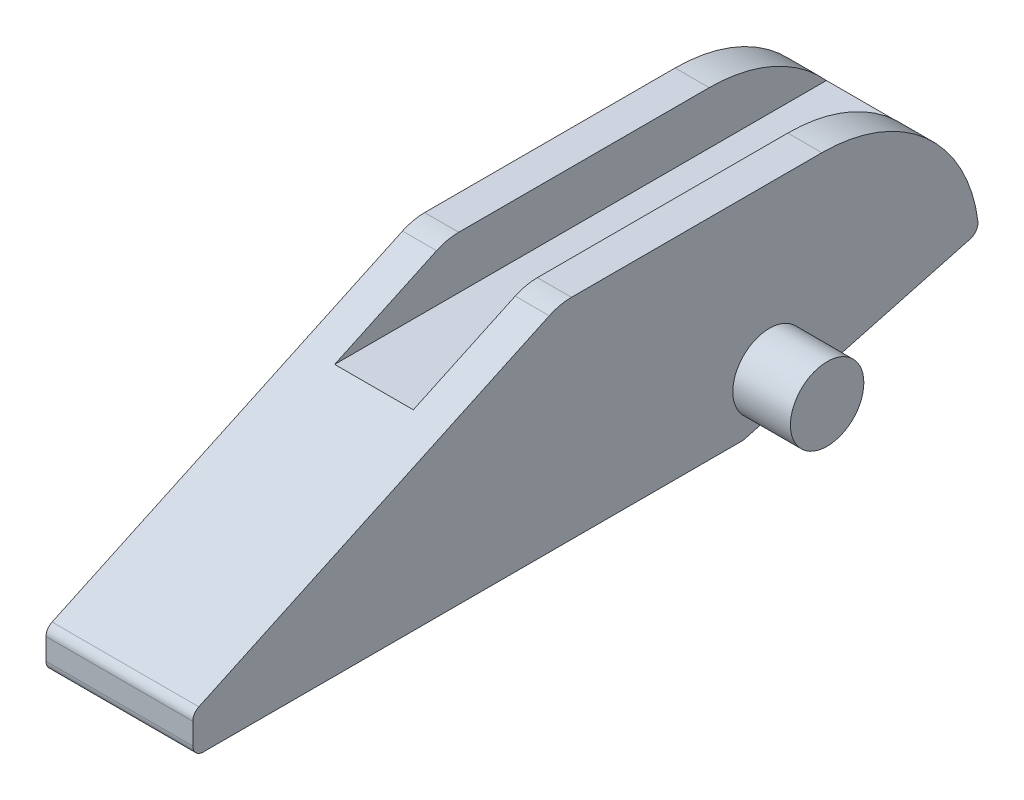
ISO-10303-21;
HEADER;
FILE_DESCRIPTION(('STEP AP214'),'2;1');
FILE_NAME('part.step','',(''),(''),'','','');
FILE_SCHEMA(('AUTOMOTIVE_DESIGN { 1 0 10303 214 1 1 1 1 }'));
ENDSEC;
DATA;
#1=APPLICATION_CONTEXT('core data for automotive mechanical design processes');
#2=APPLICATION_PROTOCOL_DEFINITION('international standard','automotive_design',2000,#1);
#3=PRODUCT_CONTEXT('',#1,'mechanical');
#4=PRODUCT('Part','Part','',(#3));
#5=PRODUCT_RELATED_PRODUCT_CATEGORY('part','',(#4));
#6=PRODUCT_DEFINITION_FORMATION('','',#4);
#7=PRODUCT_DEFINITION_CONTEXT('part definition',#1,'design');
#8=PRODUCT_DEFINITION('design','',#6,#7);
#9=PRODUCT_DEFINITION_SHAPE('','',#8);
#10=(LENGTH_UNIT() NAMED_UNIT(*) SI_UNIT(.MILLI.,.METRE.));
#11=(NAMED_UNIT(*) PLANE_ANGLE_UNIT() SI_UNIT($,.RADIAN.));
#12=(NAMED_UNIT(*) SI_UNIT($,.STERADIAN.) SOLID_ANGLE_UNIT());
#13=UNCERTAINTY_MEASURE_WITH_UNIT(LENGTH_MEASURE(1.E-05),#10,'distance_accuracy_value','');
#14=(GEOMETRIC_REPRESENTATION_CONTEXT(3) GLOBAL_UNCERTAINTY_ASSIGNED_CONTEXT((#13)) GLOBAL_UNIT_ASSIGNED_CONTEXT((#10,
#11,#12)) REPRESENTATION_CONTEXT('',''));
#15=CARTESIAN_POINT('',(0.,0.,0.));
#16=DIRECTION('',(0.,0.,1.));
#17=DIRECTION('',(1.,0.,0.));
#18=AXIS2_PLACEMENT_3D('',#15,#16,#17);
#19=CARTESIAN_POINT('',(1.4,0.999999999999998,3.));
#20=DIRECTION('',(-1.,0.,0.));
#21=DIRECTION('',(0.,0.,1.));
#22=AXIS2_PLACEMENT_3D('',#19,#20,#21);
#23=CYLINDRICAL_SURFACE('',#22,3.);
#24=CARTESIAN_POINT('',(1.4,0.999999999999998,3.));
#25=DIRECTION('',(1.,0.,0.));
#26=DIRECTION('',(0.,0.,1.));
#27=AXIS2_PLACEMENT_3D('',#24,#25,#26);
#28=CIRCLE('',#27,3.);
#29=CARTESIAN_POINT('',(1.4,1.37847392209244,0.0239695078349815));
#30=VERTEX_POINT('',#29);
#31=CARTESIAN_POINT('',(1.4,4.,3.));
#32=VERTEX_POINT('',#31);
#33=EDGE_CURVE('E255',#30,#32,#28,.T.);
#34=ORIENTED_EDGE('',*,*,#33,.F.);
#35=DIRECTION('',(-1.,0.,0.));
#36=VECTOR('',#35,1.);
#37=CARTESIAN_POINT('',(1.4,1.37847392209244,0.0239695078349811));
#38=LINE('',#37,#36);
#39=CARTESIAN_POINT('',(-1.4,1.37847392209244,0.0239695078349815));
#40=VERTEX_POINT('',#39);
#41=EDGE_CURVE('E334',#30,#40,#38,.T.);
#42=ORIENTED_EDGE('',*,*,#41,.T.);
#43=CARTESIAN_POINT('',(-1.4,0.999999999999998,3.));
#44=DIRECTION('',(1.,0.,0.));
#45=DIRECTION('',(0.,0.,1.));
#46=AXIS2_PLACEMENT_3D('',#43,#44,#45);
#47=CIRCLE('',#46,3.);
#48=CARTESIAN_POINT('',(-1.4,4.,3.));
#49=VERTEX_POINT('',#48);
#50=EDGE_CURVE('E273',#40,#49,#47,.T.);
#51=ORIENTED_EDGE('',*,*,#50,.T.);
#52=DIRECTION('',(-1.,0.,0.));
#53=VECTOR('',#52,1.);
#54=CARTESIAN_POINT('',(1.4,4.,3.));
#55=LINE('',#54,#53);
#56=CARTESIAN_POINT('',(-0.75,4.,3.));
#57=VERTEX_POINT('',#56);
#58=EDGE_CURVE('E236',#57,#49,#55,.T.);
#59=ORIENTED_EDGE('',*,*,#58,.F.);
#60=CARTESIAN_POINT('',(-0.75,0.999999999999998,3.));
#61=DIRECTION('',(1.,0.,0.));
#62=DIRECTION('',(0.,0.,-1.));
#63=AXIS2_PLACEMENT_3D('',#60,#61,#62);
#64=CIRCLE('',#63,3.);
#65=CARTESIAN_POINT('',(-0.75,3.,0.763932022500208));
#66=VERTEX_POINT('',#65);
#67=EDGE_CURVE('E226',#66,#57,#64,.T.);
#68=ORIENTED_EDGE('',*,*,#67,.F.);
#69=DIRECTION('',(-1.,0.,0.));
#70=VECTOR('',#69,1.);
#71=CARTESIAN_POINT('',(1.4,3.,0.763932022500209));
#72=LINE('',#71,#70);
#73=CARTESIAN_POINT('',(0.75,3.,0.763932022500208));
#74=VERTEX_POINT('',#73);
#75=EDGE_CURVE('E212',#66,#74,#72,.F.);
#76=ORIENTED_EDGE('',*,*,#75,.T.);
#77=CARTESIAN_POINT('',(0.75,0.999999999999998,3.));
#78=DIRECTION('',(-1.,0.,0.));
#79=DIRECTION('',(0.,0.,1.));
#80=AXIS2_PLACEMENT_3D('',#77,#78,#79);
#81=CIRCLE('',#80,3.);
#82=CARTESIAN_POINT('',(0.75,4.,3.));
#83=VERTEX_POINT('',#82);
#84=EDGE_CURVE('E243',#83,#74,#81,.T.);
#85=ORIENTED_EDGE('',*,*,#84,.F.);
#86=EDGE_CURVE('E254',#32,#83,#55,.T.);
#87=ORIENTED_EDGE('',*,*,#86,.F.);
#88=EDGE_LOOP('',(#34,#42,#51,#59,#68,#76,#85,#87));
#89=FACE_BOUND('',#88,.T.);
#90=ADVANCED_FACE('F38',(#89),#23,.T.);
#91=CARTESIAN_POINT('',(1.4,4.,7.77738173825931));
#92=DIRECTION('',(0.,-1.,0.));
#93=DIRECTION('',(0.,0.,-1.));
#94=AXIS2_PLACEMENT_3D('',#91,#92,#93);
#95=PLANE('',#94);
#96=DIRECTION('',(0.,0.,-1.));
#97=VECTOR('',#96,1.);
#98=CARTESIAN_POINT('',(-0.750000000000002,4.,15.));
#99=LINE('',#98,#97);
#100=CARTESIAN_POINT('',(-0.750000000000001,4.,7.77738173825931));
#101=VERTEX_POINT('',#100);
#102=EDGE_CURVE('E427',#101,#57,#99,.T.);
#103=ORIENTED_EDGE('',*,*,#102,.T.);
#104=ORIENTED_EDGE('',*,*,#58,.T.);
#105=DIRECTION('',(0.,0.,1.));
#106=VECTOR('',#105,1.);
#107=CARTESIAN_POINT('',(-1.4,4.,7.77738173825931));
#108=LINE('',#107,#106);
#109=CARTESIAN_POINT('',(-1.4,4.,7.77738173825931));
#110=VERTEX_POINT('',#109);
#111=EDGE_CURVE('E275',#49,#110,#108,.T.);
#112=ORIENTED_EDGE('',*,*,#111,.T.);
#113=DIRECTION('',(-1.,0.,0.));
#114=VECTOR('',#113,1.);
#115=CARTESIAN_POINT('',(1.4,4.,7.77738173825931));
#116=LINE('',#115,#114);
#117=EDGE_CURVE('E299',#101,#110,#116,.T.);
#118=ORIENTED_EDGE('',*,*,#117,.F.);
#119=EDGE_LOOP('',(#103,#104,#112,#118));
#120=FACE_BOUND('',#119,.T.);
#121=ADVANCED_FACE('F494',(#120),#95,.F.);
#122=DIRECTION('',(0.,0.,1.));
#123=VECTOR('',#122,1.);
#124=CARTESIAN_POINT('',(0.750000000000002,4.,15.));
#125=LINE('',#124,#123);
#126=CARTESIAN_POINT('',(0.750000000000001,4.,7.77738173825931));
#127=VERTEX_POINT('',#126);
#128=EDGE_CURVE('E231',#83,#127,#125,.T.);
#129=ORIENTED_EDGE('',*,*,#128,.T.);
#130=CARTESIAN_POINT('',(1.4,4.,7.77738173825931));
#131=VERTEX_POINT('',#130);
#132=EDGE_CURVE('E300',#131,#127,#116,.T.);
#133=ORIENTED_EDGE('',*,*,#132,.F.);
#134=DIRECTION('',(0.,0.,1.));
#135=VECTOR('',#134,1.);
#136=CARTESIAN_POINT('',(1.4,4.,7.77738173825931));
#137=LINE('',#136,#135);
#138=EDGE_CURVE('E257',#32,#131,#137,.T.);
#139=ORIENTED_EDGE('',*,*,#138,.F.);
#140=ORIENTED_EDGE('',*,*,#86,.T.);
#141=EDGE_LOOP('',(#129,#133,#139,#140));
#142=FACE_BOUND('',#141,.T.);
#143=ADVANCED_FACE('F439',(#142),#95,.F.);
#144=CARTESIAN_POINT('',(1.4,3.,7.77738173825931));
#145=DIRECTION('',(-1.,0.,0.));
#146=DIRECTION('',(0.,0.,1.));
#147=AXIS2_PLACEMENT_3D('',#144,#145,#146);
#148=CYLINDRICAL_SURFACE('',#147,1.);
#149=CARTESIAN_POINT('',(-0.750000000000001,3.,7.77738173825931));
#150=DIRECTION('',(1.,0.,0.));
#151=DIRECTION('',(0.,0.,-1.));
#152=AXIS2_PLACEMENT_3D('',#149,#150,#151);
#153=CIRCLE('',#152,1.);
#154=CARTESIAN_POINT('',(-0.750000000000001,3.90630778703665,8.2));
#155=VERTEX_POINT('',#154);
#156=EDGE_CURVE('E238',#101,#155,#153,.T.);
#157=ORIENTED_EDGE('',*,*,#156,.F.);
#158=ORIENTED_EDGE('',*,*,#117,.T.);
#159=CARTESIAN_POINT('',(-1.4,3.,7.77738173825931));
#160=DIRECTION('',(1.,0.,0.));
#161=DIRECTION('',(0.,0.,1.));
#162=AXIS2_PLACEMENT_3D('',#159,#160,#161);
#163=CIRCLE('',#162,1.);
#164=CARTESIAN_POINT('',(-1.4,3.90630778703665,8.2));
#165=VERTEX_POINT('',#164);
#166=EDGE_CURVE('E278',#110,#165,#163,.T.);
#167=ORIENTED_EDGE('',*,*,#166,.T.);
#168=DIRECTION('',(-1.,0.,0.));
#169=VECTOR('',#168,1.);
#170=CARTESIAN_POINT('',(1.4,3.90630778703665,8.2));
#171=LINE('',#170,#169);
#172=EDGE_CURVE('E295',#155,#165,#171,.T.);
#173=ORIENTED_EDGE('',*,*,#172,.F.);
#174=EDGE_LOOP('',(#157,#158,#167,#173));
#175=FACE_BOUND('',#174,.T.);
#176=ADVANCED_FACE('F491',(#175),#148,.T.);
#177=CARTESIAN_POINT('',(0.750000000000001,3.,7.77738173825931));
#178=DIRECTION('',(-1.,0.,0.));
#179=DIRECTION('',(0.,0.,1.));
#180=AXIS2_PLACEMENT_3D('',#177,#178,#179);
#181=CIRCLE('',#180,1.);
#182=CARTESIAN_POINT('',(0.750000000000001,3.90630778703665,8.2));
#183=VERTEX_POINT('',#182);
#184=EDGE_CURVE('E222',#183,#127,#181,.T.);
#185=ORIENTED_EDGE('',*,*,#184,.F.);
#186=CARTESIAN_POINT('',(1.4,3.90630778703665,8.2));
#187=VERTEX_POINT('',#186);
#188=EDGE_CURVE('E296',#187,#183,#171,.T.);
#189=ORIENTED_EDGE('',*,*,#188,.F.);
#190=CARTESIAN_POINT('',(1.4,3.,7.77738173825931));
#191=DIRECTION('',(1.,0.,0.));
#192=DIRECTION('',(0.,0.,1.));
#193=AXIS2_PLACEMENT_3D('',#190,#191,#192);
#194=CIRCLE('',#193,1.);
#195=EDGE_CURVE('E260',#131,#187,#194,.T.);
#196=ORIENTED_EDGE('',*,*,#195,.F.);
#197=ORIENTED_EDGE('',*,*,#132,.T.);
#198=EDGE_LOOP('',(#185,#189,#196,#197));
#199=FACE_BOUND('',#198,.T.);
#200=ADVANCED_FACE('F638',(#199),#148,.T.);
#201=CARTESIAN_POINT('',(1.4,0.789263216828548,14.8845236523481));
#202=DIRECTION('',(0.,-0.906307787036653,-0.422618261740694));
#203=DIRECTION('',(0.,0.422618261740694,-0.906307787036653));
#204=AXIS2_PLACEMENT_3D('',#201,#202,#203);
#205=PLANE('',#204);
#206=DIRECTION('',(0.,-0.422618261740694,0.906307787036653));
#207=VECTOR('',#206,1.);
#208=CARTESIAN_POINT('',(-0.750000000000002,0.789263216828548,14.8845236523481));
#209=LINE('',#208,#207);
#210=CARTESIAN_POINT('',(-0.750000000000002,3.,10.1435833214118));
#211=VERTEX_POINT('',#210);
#212=EDGE_CURVE('E229',#155,#211,#209,.T.);
#213=ORIENTED_EDGE('',*,*,#212,.F.);
#214=ORIENTED_EDGE('',*,*,#172,.T.);
#215=DIRECTION('',(0.,-0.422618261740694,0.906307787036653));
#216=VECTOR('',#215,1.);
#217=CARTESIAN_POINT('',(-1.4,0.789263216828548,14.8845236523481));
#218=LINE('',#217,#216);
#219=CARTESIAN_POINT('',(-1.4,0.789263216828549,14.8845236523481));
#220=VERTEX_POINT('',#219);
#221=EDGE_CURVE('E281',#165,#220,#218,.T.);
#222=ORIENTED_EDGE('',*,*,#221,.T.);
#223=DIRECTION('',(-1.,0.,0.));
#224=VECTOR('',#223,1.);
#225=CARTESIAN_POINT('',(1.4,0.789263216828549,14.8845236523481));
#226=LINE('',#225,#224);
#227=CARTESIAN_POINT('',(1.4,0.789263216828549,14.8845236523481));
#228=VERTEX_POINT('',#227);
#229=EDGE_CURVE('E292',#228,#220,#226,.T.);
#230=ORIENTED_EDGE('',*,*,#229,.F.);
#231=DIRECTION('',(0.,-0.422618261740694,0.906307787036653));
#232=VECTOR('',#231,1.);
#233=CARTESIAN_POINT('',(1.4,0.789263216828548,14.8845236523481));
#234=LINE('',#233,#232);
#235=EDGE_CURVE('E262',#187,#228,#234,.T.);
#236=ORIENTED_EDGE('',*,*,#235,.F.);
#237=ORIENTED_EDGE('',*,*,#188,.T.);
#238=DIRECTION('',(0.,0.422618261740694,-0.906307787036653));
#239=VECTOR('',#238,1.);
#240=CARTESIAN_POINT('',(0.750000000000002,0.789263216828548,14.8845236523481));
#241=LINE('',#240,#239);
#242=CARTESIAN_POINT('',(0.750000000000001,3.,10.1435833214118));
#243=VERTEX_POINT('',#242);
#244=EDGE_CURVE('E308',#243,#183,#241,.T.);
#245=ORIENTED_EDGE('',*,*,#244,.F.);
#246=DIRECTION('',(-1.,0.,0.));
#247=VECTOR('',#246,1.);
#248=CARTESIAN_POINT('',(1.4,3.,10.1435833214118));
#249=LINE('',#248,#247);
#250=EDGE_CURVE('E253',#243,#211,#249,.T.);
#251=ORIENTED_EDGE('',*,*,#250,.T.);
#252=EDGE_LOOP('',(#213,#214,#222,#230,#236,#237,#245,#251));
#253=FACE_BOUND('',#252,.T.);
#254=ADVANCED_FACE('F486',(#253),#205,.F.);
#255=CARTESIAN_POINT('',(1.4,0.608001659421218,14.8));
#256=DIRECTION('',(-1.,0.,0.));
#257=DIRECTION('',(0.,0.,1.));
#258=AXIS2_PLACEMENT_3D('',#255,#256,#257);
#259=CYLINDRICAL_SURFACE('',#258,0.2);
#260=CARTESIAN_POINT('',(-1.4,0.608001659421218,14.8));
#261=DIRECTION('',(1.,0.,0.));
#262=DIRECTION('',(0.,0.,1.));
#263=AXIS2_PLACEMENT_3D('',#260,#261,#262);
#264=CIRCLE('',#263,0.2);
#265=CARTESIAN_POINT('',(-1.4,0.608001659421218,15.));
#266=VERTEX_POINT('',#265);
#267=EDGE_CURVE('E283',#220,#266,#264,.T.);
#268=ORIENTED_EDGE('',*,*,#267,.T.);
#269=DIRECTION('',(-1.,0.,0.));
#270=VECTOR('',#269,1.);
#271=CARTESIAN_POINT('',(1.4,0.608001659421218,15.));
#272=LINE('',#271,#270);
#273=CARTESIAN_POINT('',(1.4,0.608001659421218,15.));
#274=VERTEX_POINT('',#273);
#275=EDGE_CURVE('E272',#274,#266,#272,.T.);
#276=ORIENTED_EDGE('',*,*,#275,.F.);
#277=CARTESIAN_POINT('',(1.4,0.608001659421218,14.8));
#278=DIRECTION('',(1.,0.,0.));
#279=DIRECTION('',(0.,0.,1.));
#280=AXIS2_PLACEMENT_3D('',#277,#278,#279);
#281=CIRCLE('',#280,0.2);
#282=EDGE_CURVE('E264',#228,#274,#281,.T.);
#283=ORIENTED_EDGE('',*,*,#282,.F.);
#284=ORIENTED_EDGE('',*,*,#229,.T.);
#285=EDGE_LOOP('',(#268,#276,#283,#284));
#286=FACE_BOUND('',#285,.T.);
#287=ADVANCED_FACE('F481',(#286),#259,.T.);
#288=CARTESIAN_POINT('',(1.4,0.608001659421218,15.));
#289=DIRECTION('',(0.,0.,-1.));
#290=DIRECTION('',(-1.,0.,0.));
#291=AXIS2_PLACEMENT_3D('',#288,#289,#290);
#292=PLANE('',#291);
#293=DIRECTION('',(0.,-1.,0.));
#294=VECTOR('',#293,1.);
#295=CARTESIAN_POINT('',(-1.4,0.608001659421218,15.));
#296=LINE('',#295,#294);
#297=CARTESIAN_POINT('',(-1.4,0.199999999999998,15.));
#298=VERTEX_POINT('',#297);
#299=EDGE_CURVE('E285',#266,#298,#296,.T.);
#300=ORIENTED_EDGE('',*,*,#299,.T.);
#301=DIRECTION('',(-1.,0.,0.));
#302=VECTOR('',#301,1.);
#303=CARTESIAN_POINT('',(1.4,0.199999999999998,15.));
#304=LINE('',#303,#302);
#305=CARTESIAN_POINT('',(1.4,0.199999999999998,15.));
#306=VERTEX_POINT('',#305);
#307=EDGE_CURVE('E326',#298,#306,#304,.F.);
#308=ORIENTED_EDGE('',*,*,#307,.T.);
#309=DIRECTION('',(0.,-1.,0.));
#310=VECTOR('',#309,1.);
#311=CARTESIAN_POINT('',(1.4,0.608001659421218,15.));
#312=LINE('',#311,#310);
#313=EDGE_CURVE('E266',#274,#306,#312,.T.);
#314=ORIENTED_EDGE('',*,*,#313,.F.);
#315=ORIENTED_EDGE('',*,*,#275,.T.);
#316=EDGE_LOOP('',(#300,#308,#314,#315));
#317=FACE_BOUND('',#316,.T.);
#318=ADVANCED_FACE('F476',(#317),#292,.F.);
#319=CARTESIAN_POINT('',(1.4,0.,0.));
#320=DIRECTION('',(0.,1.,0.));
#321=DIRECTION('',(0.,0.,1.));
#322=AXIS2_PLACEMENT_3D('',#319,#320,#321);
#323=PLANE('',#322);
#324=DIRECTION('',(1.,0.,0.));
#325=VECTOR('',#324,1.);
#326=CARTESIAN_POINT('',(0.8,0.,5.52633049951747));
#327=LINE('',#326,#325);
#328=CARTESIAN_POINT('',(-0.6,0.,5.52633049951747));
#329=VERTEX_POINT('',#328);
#330=CARTESIAN_POINT('',(0.6,0.,5.52633049951747));
#331=VERTEX_POINT('',#330);
#332=EDGE_CURVE('E413',#329,#331,#327,.T.);
#333=ORIENTED_EDGE('',*,*,#332,.F.);
#334=CARTESIAN_POINT('',(-0.6,0.,5.72633049951747));
#335=DIRECTION('',(0.,1.,0.));
#336=DIRECTION('',(0.,0.,1.));
#337=AXIS2_PLACEMENT_3D('',#334,#335,#336);
#338=CIRCLE('',#337,0.2);
#339=CARTESIAN_POINT('',(-0.8,0.,5.72633049951747));
#340=VERTEX_POINT('',#339);
#341=EDGE_CURVE('E375',#329,#340,#338,.T.);
#342=ORIENTED_EDGE('',*,*,#341,.T.);
#343=DIRECTION('',(0.,0.,-1.));
#344=VECTOR('',#343,1.);
#345=CARTESIAN_POINT('',(-0.8,0.,13.8));
#346=LINE('',#345,#344);
#347=CARTESIAN_POINT('',(-0.8,0.,13.6));
#348=VERTEX_POINT('',#347);
#349=EDGE_CURVE('E411',#348,#340,#346,.T.);
#350=ORIENTED_EDGE('',*,*,#349,.F.);
#351=CARTESIAN_POINT('',(-0.6,0.,13.6));
#352=DIRECTION('',(0.,1.,0.));
#353=DIRECTION('',(0.,0.,1.));
#354=AXIS2_PLACEMENT_3D('',#351,#352,#353);
#355=CIRCLE('',#354,0.2);
#356=CARTESIAN_POINT('',(-0.6,0.,13.8));
#357=VERTEX_POINT('',#356);
#358=EDGE_CURVE('E373',#348,#357,#355,.T.);
#359=ORIENTED_EDGE('',*,*,#358,.T.);
#360=DIRECTION('',(-1.,0.,0.));
#361=VECTOR('',#360,1.);
#362=CARTESIAN_POINT('',(0.8,0.,13.8));
#363=LINE('',#362,#361);
#364=CARTESIAN_POINT('',(0.6,0.,13.8));
#365=VERTEX_POINT('',#364);
#366=EDGE_CURVE('E422',#365,#357,#363,.T.);
#367=ORIENTED_EDGE('',*,*,#366,.F.);
#368=CARTESIAN_POINT('',(0.6,0.,13.6));
#369=DIRECTION('',(0.,1.,0.));
#370=DIRECTION('',(0.,0.,1.));
#371=AXIS2_PLACEMENT_3D('',#368,#369,#370);
#372=CIRCLE('',#371,0.2);
#373=CARTESIAN_POINT('',(0.8,0.,13.6));
#374=VERTEX_POINT('',#373);
#375=EDGE_CURVE('E11',#365,#374,#372,.T.);
#376=ORIENTED_EDGE('',*,*,#375,.T.);
#377=DIRECTION('',(0.,0.,1.));
#378=VECTOR('',#377,1.);
#379=CARTESIAN_POINT('',(0.8,0.,13.8));
#380=LINE('',#379,#378);
#381=CARTESIAN_POINT('',(0.8,0.,5.72633049951747));
#382=VERTEX_POINT('',#381);
#383=EDGE_CURVE('E417',#382,#374,#380,.T.);
#384=ORIENTED_EDGE('',*,*,#383,.F.);
#385=CARTESIAN_POINT('',(0.6,0.,5.72633049951747));
#386=DIRECTION('',(0.,1.,0.));
#387=DIRECTION('',(0.,0.,1.));
#388=AXIS2_PLACEMENT_3D('',#385,#386,#387);
#389=CIRCLE('',#388,0.2);
#390=EDGE_CURVE('E47',#382,#331,#389,.T.);
#391=ORIENTED_EDGE('',*,*,#390,.T.);
#392=EDGE_LOOP('',(#333,#342,#350,#359,#367,#376,#384,#391));
#393=FACE_BOUND('',#392,.T.);
#394=DIRECTION('',(0.,0.,-1.));
#395=VECTOR('',#394,1.);
#396=CARTESIAN_POINT('',(1.4,0.,0.));
#397=LINE('',#396,#395);
#398=CARTESIAN_POINT('',(1.4,0.,14.8));
#399=VERTEX_POINT('',#398);
#400=CARTESIAN_POINT('',(1.4,0.,4.52633049951747));
#401=VERTEX_POINT('',#400);
#402=EDGE_CURVE('E269',#399,#401,#397,.T.);
#403=ORIENTED_EDGE('',*,*,#402,.F.);
#404=DIRECTION('',(-1.,0.,0.));
#405=VECTOR('',#404,1.);
#406=CARTESIAN_POINT('',(1.4,0.,14.8));
#407=LINE('',#406,#405);
#408=CARTESIAN_POINT('',(-1.4,0.,14.8));
#409=VERTEX_POINT('',#408);
#410=EDGE_CURVE('E317',#399,#409,#407,.T.);
#411=ORIENTED_EDGE('',*,*,#410,.T.);
#412=DIRECTION('',(0.,0.,-1.));
#413=VECTOR('',#412,1.);
#414=CARTESIAN_POINT('',(-1.4,0.,0.));
#415=LINE('',#414,#413);
#416=CARTESIAN_POINT('',(-1.4,0.,4.52633049951747));
#417=VERTEX_POINT('',#416);
#418=EDGE_CURVE('E258',#409,#417,#415,.T.);
#419=ORIENTED_EDGE('',*,*,#418,.T.);
#420=DIRECTION('',(1.,0.,0.));
#421=VECTOR('',#420,1.);
#422=CARTESIAN_POINT('',(1.4,0.,4.52633049951747));
#423=LINE('',#422,#421);
#424=EDGE_CURVE('E314',#417,#401,#423,.T.);
#425=ORIENTED_EDGE('',*,*,#424,.T.);
#426=EDGE_LOOP('',(#403,#411,#419,#425));
#427=FACE_BOUND('',#426,.T.);
#428=ADVANCED_FACE('F467',(#393,#427),#323,.F.);
#429=CARTESIAN_POINT('',(1.4,0.608001659421218,14.8));
#430=DIRECTION('',(-1.,0.,0.));
#431=DIRECTION('',(0.,0.,1.));
#432=AXIS2_PLACEMENT_3D('',#429,#430,#431);
#433=PLANE('',#432);
#434=CARTESIAN_POINT('',(1.4,0.899999999999998,4.));
#435=DIRECTION('',(-1.,0.,0.));
#436=DIRECTION('',(0.,0.,1.));
#437=AXIS2_PLACEMENT_3D('',#434,#435,#436);
#438=CIRCLE('',#437,0.7);
#439=CARTESIAN_POINT('',(1.4,0.899999999999998,4.7));
#440=VERTEX_POINT('',#439);
#441=EDGE_CURVE('E250',#440,#440,#438,.F.);
#442=ORIENTED_EDGE('',*,*,#441,.F.);
#443=EDGE_LOOP('',(#442));
#444=FACE_BOUND('',#443,.T.);
#445=ORIENTED_EDGE('',*,*,#313,.T.);
#446=CARTESIAN_POINT('',(1.4,0.199999999999998,14.8));
#447=DIRECTION('',(-1.,0.,0.));
#448=DIRECTION('',(0.,0.,1.));
#449=AXIS2_PLACEMENT_3D('',#446,#447,#448);
#450=CIRCLE('',#449,0.2);
#451=EDGE_CURVE('E332',#306,#399,#450,.F.);
#452=ORIENTED_EDGE('',*,*,#451,.T.);
#453=ORIENTED_EDGE('',*,*,#402,.T.);
#454=CARTESIAN_POINT('',(1.4,0.199999999999999,4.52633049951747));
#455=DIRECTION('',(-1.,0.,0.));
#456=DIRECTION('',(0.,0.,1.));
#457=AXIS2_PLACEMENT_3D('',#454,#455,#456);
#458=CIRCLE('',#457,0.2);
#459=CARTESIAN_POINT('',(1.4,0.00681483474218548,4.47456669049696));
#460=VERTEX_POINT('',#459);
#461=EDGE_CURVE('E328',#401,#460,#458,.F.);
#462=ORIENTED_EDGE('',*,*,#461,.T.);
#463=DIRECTION('',(0.,0.258819045102515,-0.96592582628907));
#464=VECTOR('',#463,1.);
#465=CARTESIAN_POINT('',(1.4,-2.53427161159027,13.9580304146346));
#466=LINE('',#465,#464);
#467=CARTESIAN_POINT('',(1.4,1.16005716202847,0.17060773162548));
#468=VERTEX_POINT('',#467);
#469=EDGE_CURVE('E425',#460,#468,#466,.T.);
#470=ORIENTED_EDGE('',*,*,#469,.T.);
#471=CARTESIAN_POINT('',(1.4,1.35324232728628,0.222371540645983));
#472=DIRECTION('',(-1.,0.,0.));
#473=DIRECTION('',(0.,0.,1.));
#474=AXIS2_PLACEMENT_3D('',#471,#472,#473);
#475=CIRCLE('',#474,0.2);
#476=EDGE_CURVE('E330',#468,#30,#475,.F.);
#477=ORIENTED_EDGE('',*,*,#476,.T.);
#478=ORIENTED_EDGE('',*,*,#33,.T.);
#479=ORIENTED_EDGE('',*,*,#138,.T.);
#480=ORIENTED_EDGE('',*,*,#195,.T.);
#481=ORIENTED_EDGE('',*,*,#235,.T.);
#482=ORIENTED_EDGE('',*,*,#282,.T.);
#483=EDGE_LOOP('',(#445,#452,#453,#462,#470,#477,#478,#479,#480,#481,#482));
#484=FACE_BOUND('',#483,.T.);
#485=ADVANCED_FACE('F443',(#444,#484),#433,.F.);
#486=CARTESIAN_POINT('',(-1.4,0.608001659421218,14.8));
#487=DIRECTION('',(-1.,0.,0.));
#488=DIRECTION('',(0.,0.,1.));
#489=AXIS2_PLACEMENT_3D('',#486,#487,#488);
#490=PLANE('',#489);
#491=ORIENTED_EDGE('',*,*,#418,.F.);
#492=CARTESIAN_POINT('',(-1.4,0.199999999999998,14.8));
#493=DIRECTION('',(-1.,0.,0.));
#494=DIRECTION('',(0.,0.,1.));
#495=AXIS2_PLACEMENT_3D('',#492,#493,#494);
#496=CIRCLE('',#495,0.2);
#497=EDGE_CURVE('E324',#409,#298,#496,.T.);
#498=ORIENTED_EDGE('',*,*,#497,.T.);
#499=ORIENTED_EDGE('',*,*,#299,.F.);
#500=ORIENTED_EDGE('',*,*,#267,.F.);
#501=ORIENTED_EDGE('',*,*,#221,.F.);
#502=ORIENTED_EDGE('',*,*,#166,.F.);
#503=ORIENTED_EDGE('',*,*,#111,.F.);
#504=ORIENTED_EDGE('',*,*,#50,.F.);
#505=CARTESIAN_POINT('',(-1.4,1.35324232728628,0.222371540645983));
#506=DIRECTION('',(-1.,0.,0.));
#507=DIRECTION('',(0.,0.,1.));
#508=AXIS2_PLACEMENT_3D('',#505,#506,#507);
#509=CIRCLE('',#508,0.2);
#510=CARTESIAN_POINT('',(-1.4,1.16005716202847,0.17060773162548));
#511=VERTEX_POINT('',#510);
#512=EDGE_CURVE('E322',#40,#511,#509,.T.);
#513=ORIENTED_EDGE('',*,*,#512,.T.);
#514=DIRECTION('',(0.,0.258819045102515,-0.96592582628907));
#515=VECTOR('',#514,1.);
#516=CARTESIAN_POINT('',(-1.4,-2.53427161159027,13.9580304146346));
#517=LINE('',#516,#515);
#518=CARTESIAN_POINT('',(-1.4,0.00681483474218548,4.47456669049696));
#519=VERTEX_POINT('',#518);
#520=EDGE_CURVE('E311',#519,#511,#517,.T.);
#521=ORIENTED_EDGE('',*,*,#520,.F.);
#522=CARTESIAN_POINT('',(-1.4,0.199999999999999,4.52633049951747));
#523=DIRECTION('',(-1.,0.,0.));
#524=DIRECTION('',(0.,0.,1.));
#525=AXIS2_PLACEMENT_3D('',#522,#523,#524);
#526=CIRCLE('',#525,0.2);
#527=EDGE_CURVE('E320',#519,#417,#526,.T.);
#528=ORIENTED_EDGE('',*,*,#527,.T.);
#529=EDGE_LOOP('',(#491,#498,#499,#500,#501,#502,#503,#504,#513,#521,#528));
#530=FACE_BOUND('',#529,.T.);
#531=CARTESIAN_POINT('',(-1.4,0.899999999999998,4.));
#532=DIRECTION('',(-1.,0.,0.));
#533=DIRECTION('',(0.,0.,1.));
#534=AXIS2_PLACEMENT_3D('',#531,#532,#533);
#535=CIRCLE('',#534,0.7);
#536=CARTESIAN_POINT('',(-1.4,0.899999999999998,4.7));
#537=VERTEX_POINT('',#536);
#538=EDGE_CURVE('E248',#537,#537,#535,.F.);
#539=ORIENTED_EDGE('',*,*,#538,.T.);
#540=EDGE_LOOP('',(#539));
#541=FACE_BOUND('',#540,.T.);
#542=ADVANCED_FACE('F454',(#530,#541),#490,.T.);
#543=CARTESIAN_POINT('',(-2.5,0.899999999999998,4.));
#544=DIRECTION('',(1.,0.,0.));
#545=DIRECTION('',(0.,0.,-1.));
#546=AXIS2_PLACEMENT_3D('',#543,#544,#545);
#547=PLANE('',#546);
#548=CARTESIAN_POINT('',(-2.5,0.899999999999998,4.));
#549=DIRECTION('',(1.,0.,0.));
#550=DIRECTION('',(0.,0.,-1.));
#551=AXIS2_PLACEMENT_3D('',#548,#549,#550);
#552=CIRCLE('',#551,0.7);
#553=CARTESIAN_POINT('',(-2.5,0.899999999999998,3.3));
#554=VERTEX_POINT('',#553);
#555=EDGE_CURVE('E237',#554,#554,#552,.T.);
#556=ORIENTED_EDGE('',*,*,#555,.F.);
#557=EDGE_LOOP('',(#556));
#558=FACE_BOUND('',#557,.T.);
#559=ADVANCED_FACE('F619',(#558),#547,.F.);
#560=CARTESIAN_POINT('',(2.5,0.899999999999998,4.));
#561=DIRECTION('',(-1.,0.,0.));
#562=DIRECTION('',(0.,0.,1.));
#563=AXIS2_PLACEMENT_3D('',#560,#561,#562);
#564=CYLINDRICAL_SURFACE('',#563,0.7);
#565=ORIENTED_EDGE('',*,*,#538,.F.);
#566=EDGE_LOOP('',(#565));
#567=FACE_BOUND('',#566,.T.);
#568=ORIENTED_EDGE('',*,*,#555,.T.);
#569=EDGE_LOOP('',(#568));
#570=FACE_BOUND('',#569,.T.);
#571=ADVANCED_FACE('F622',(#567,#570),#564,.T.);
#572=CARTESIAN_POINT('',(2.5,0.899999999999998,4.));
#573=DIRECTION('',(1.,0.,0.));
#574=DIRECTION('',(0.,0.,-1.));
#575=AXIS2_PLACEMENT_3D('',#572,#573,#574);
#576=CIRCLE('',#575,0.7);
#577=CARTESIAN_POINT('',(2.5,0.899999999999998,3.3));
#578=VERTEX_POINT('',#577);
#579=EDGE_CURVE('E241',#578,#578,#576,.T.);
#580=ORIENTED_EDGE('',*,*,#579,.F.);
#581=EDGE_LOOP('',(#580));
#582=FACE_BOUND('',#581,.T.);
#583=ORIENTED_EDGE('',*,*,#441,.T.);
#584=EDGE_LOOP('',(#583));
#585=FACE_BOUND('',#584,.T.);
#586=ADVANCED_FACE('F617',(#582,#585),#564,.T.);
#587=CARTESIAN_POINT('',(2.5,0.899999999999998,4.));
#588=DIRECTION('',(1.,0.,0.));
#589=DIRECTION('',(0.,0.,-1.));
#590=AXIS2_PLACEMENT_3D('',#587,#588,#589);
#591=PLANE('',#590);
#592=ORIENTED_EDGE('',*,*,#579,.T.);
#593=EDGE_LOOP('',(#592));
#594=FACE_BOUND('',#593,.T.);
#595=ADVANCED_FACE('F614',(#594),#591,.T.);
#596=CARTESIAN_POINT('',(-0.750000000000002,3.,15.));
#597=DIRECTION('',(1.,0.,0.));
#598=DIRECTION('',(0.,0.,-1.));
#599=AXIS2_PLACEMENT_3D('',#596,#597,#598);
#600=PLANE('',#599);
#601=ORIENTED_EDGE('',*,*,#67,.T.);
#602=ORIENTED_EDGE('',*,*,#102,.F.);
#603=ORIENTED_EDGE('',*,*,#156,.T.);
#604=ORIENTED_EDGE('',*,*,#212,.T.);
#605=DIRECTION('',(0.,0.,-1.));
#606=VECTOR('',#605,1.);
#607=CARTESIAN_POINT('',(-0.750000000000002,3.,15.));
#608=LINE('',#607,#606);
#609=EDGE_CURVE('E215',#211,#66,#608,.T.);
#610=ORIENTED_EDGE('',*,*,#609,.T.);
#611=EDGE_LOOP('',(#601,#602,#603,#604,#610));
#612=FACE_BOUND('',#611,.T.);
#613=ADVANCED_FACE('F225',(#612),#600,.T.);
#614=CARTESIAN_POINT('',(0.750000000000002,3.,15.));
#615=DIRECTION('',(-1.,0.,0.));
#616=DIRECTION('',(0.,0.,1.));
#617=AXIS2_PLACEMENT_3D('',#614,#615,#616);
#618=PLANE('',#617);
#619=ORIENTED_EDGE('',*,*,#84,.T.);
#620=DIRECTION('',(0.,0.,1.));
#621=VECTOR('',#620,1.);
#622=CARTESIAN_POINT('',(0.750000000000002,3.,15.));
#623=LINE('',#622,#621);
#624=EDGE_CURVE('E218',#74,#243,#623,.T.);
#625=ORIENTED_EDGE('',*,*,#624,.T.);
#626=ORIENTED_EDGE('',*,*,#244,.T.);
#627=ORIENTED_EDGE('',*,*,#184,.T.);
#628=ORIENTED_EDGE('',*,*,#128,.F.);
#629=EDGE_LOOP('',(#619,#625,#626,#627,#628));
#630=FACE_BOUND('',#629,.T.);
#631=ADVANCED_FACE('F434',(#630),#618,.T.);
#632=CARTESIAN_POINT('',(0.,3.,0.));
#633=DIRECTION('',(0.,-1.,0.));
#634=DIRECTION('',(0.,0.,-1.));
#635=AXIS2_PLACEMENT_3D('',#632,#633,#634);
#636=PLANE('',#635);
#637=ORIENTED_EDGE('',*,*,#609,.F.);
#638=ORIENTED_EDGE('',*,*,#250,.F.);
#639=ORIENTED_EDGE('',*,*,#624,.F.);
#640=ORIENTED_EDGE('',*,*,#75,.F.);
#641=EDGE_LOOP('',(#637,#638,#639,#640));
#642=FACE_BOUND('',#641,.T.);
#643=ADVANCED_FACE('F214',(#642),#636,.F.);
#644=CARTESIAN_POINT('',(-2.5,0.,4.5));
#645=DIRECTION('',(0.,0.96592582628907,0.258819045102515));
#646=DIRECTION('',(0.,-0.258819045102515,0.96592582628907));
#647=AXIS2_PLACEMENT_3D('',#644,#645,#646);
#648=PLANE('',#647);
#649=ORIENTED_EDGE('',*,*,#520,.T.);
#650=DIRECTION('',(-1.,0.,0.));
#651=VECTOR('',#650,1.);
#652=CARTESIAN_POINT('',(-2.5,1.16005716202847,0.17060773162548));
#653=LINE('',#652,#651);
#654=EDGE_CURVE('E339',#511,#468,#653,.F.);
#655=ORIENTED_EDGE('',*,*,#654,.T.);
#656=ORIENTED_EDGE('',*,*,#469,.F.);
#657=DIRECTION('',(1.,0.,0.));
#658=VECTOR('',#657,1.);
#659=CARTESIAN_POINT('',(-2.5,0.00681483474218531,4.47456669049697));
#660=LINE('',#659,#658);
#661=EDGE_CURVE('E337',#460,#519,#660,.F.);
#662=ORIENTED_EDGE('',*,*,#661,.T.);
#663=EDGE_LOOP('',(#649,#655,#656,#662));
#664=FACE_BOUND('',#663,.T.);
#665=ADVANCED_FACE('F459',(#664),#648,.F.);
#666=CARTESIAN_POINT('',(1.4,0.199999999999998,14.8));
#667=DIRECTION('',(-1.,0.,0.));
#668=DIRECTION('',(0.,0.,1.));
#669=AXIS2_PLACEMENT_3D('',#666,#667,#668);
#670=CYLINDRICAL_SURFACE('',#669,0.2);
#671=ORIENTED_EDGE('',*,*,#451,.F.);
#672=ORIENTED_EDGE('',*,*,#307,.F.);
#673=ORIENTED_EDGE('',*,*,#497,.F.);
#674=ORIENTED_EDGE('',*,*,#410,.F.);
#675=EDGE_LOOP('',(#671,#672,#673,#674));
#676=FACE_BOUND('',#675,.T.);
#677=ADVANCED_FACE('F471',(#676),#670,.T.);
#678=CARTESIAN_POINT('',(1.4,1.35324232728628,0.222371540645983));
#679=DIRECTION('',(-1.,0.,0.));
#680=DIRECTION('',(0.,0.,1.));
#681=AXIS2_PLACEMENT_3D('',#678,#679,#680);
#682=CYLINDRICAL_SURFACE('',#681,0.2);
#683=ORIENTED_EDGE('',*,*,#476,.F.);
#684=ORIENTED_EDGE('',*,*,#654,.F.);
#685=ORIENTED_EDGE('',*,*,#512,.F.);
#686=ORIENTED_EDGE('',*,*,#41,.F.);
#687=EDGE_LOOP('',(#683,#684,#685,#686));
#688=FACE_BOUND('',#687,.T.);
#689=ADVANCED_FACE('F449',(#688),#682,.T.);
#690=CARTESIAN_POINT('',(1.4,0.199999999999999,4.52633049951747));
#691=DIRECTION('',(1.,0.,0.));
#692=DIRECTION('',(0.,0.,-1.));
#693=AXIS2_PLACEMENT_3D('',#690,#691,#692);
#694=CYLINDRICAL_SURFACE('',#693,0.2);
#695=ORIENTED_EDGE('',*,*,#527,.F.);
#696=ORIENTED_EDGE('',*,*,#661,.F.);
#697=ORIENTED_EDGE('',*,*,#461,.F.);
#698=ORIENTED_EDGE('',*,*,#424,.F.);
#699=EDGE_LOOP('',(#695,#696,#697,#698));
#700=FACE_BOUND('',#699,.T.);
#701=ADVANCED_FACE('F463',(#700),#694,.T.);
#702=CARTESIAN_POINT('',(-0.8,0.999999999999998,13.8));
#703=DIRECTION('',(-1.,0.,0.));
#704=DIRECTION('',(0.,0.,1.));
#705=AXIS2_PLACEMENT_3D('',#702,#703,#704);
#706=PLANE('',#705);
#707=DIRECTION('',(0.,0.,-1.));
#708=VECTOR('',#707,1.);
#709=CARTESIAN_POINT('',(-0.8,0.799999999999998,13.8));
#710=LINE('',#709,#708);
#711=CARTESIAN_POINT('',(-0.8,0.799999999999999,5.72633049951747));
#712=VERTEX_POINT('',#711);
#713=CARTESIAN_POINT('',(-0.8,0.799999999999998,13.6));
#714=VERTEX_POINT('',#713);
#715=EDGE_CURVE('E55',#712,#714,#710,.F.);
#716=ORIENTED_EDGE('',*,*,#715,.T.);
#717=DIRECTION('',(0.,-1.,0.));
#718=VECTOR('',#717,1.);
#719=CARTESIAN_POINT('',(-0.8,0.,13.6));
#720=LINE('',#719,#718);
#721=EDGE_CURVE('E371',#714,#348,#720,.T.);
#722=ORIENTED_EDGE('',*,*,#721,.T.);
#723=ORIENTED_EDGE('',*,*,#349,.T.);
#724=DIRECTION('',(0.,-1.,0.));
#725=VECTOR('',#724,1.);
#726=CARTESIAN_POINT('',(-0.8,0.999999999999999,5.72633049951747));
#727=LINE('',#726,#725);
#728=EDGE_CURVE('E60',#340,#712,#727,.F.);
#729=ORIENTED_EDGE('',*,*,#728,.T.);
#730=EDGE_LOOP('',(#716,#722,#723,#729));
#731=FACE_BOUND('',#730,.T.);
#732=ADVANCED_FACE('F511',(#731),#706,.F.);
#733=CARTESIAN_POINT('',(0.8,0.999999999999998,13.8));
#734=DIRECTION('',(0.,0.,1.));
#735=DIRECTION('',(0.,-1.,0.));
#736=AXIS2_PLACEMENT_3D('',#733,#734,#735);
#737=PLANE('',#736);
#738=ORIENTED_EDGE('',*,*,#366,.T.);
#739=DIRECTION('',(0.,-1.,0.));
#740=VECTOR('',#739,1.);
#741=CARTESIAN_POINT('',(-0.6,0.999999999999998,13.8));
#742=LINE('',#741,#740);
#743=CARTESIAN_POINT('',(-0.6,0.799999999999998,13.8));
#744=VERTEX_POINT('',#743);
#745=EDGE_CURVE('E355',#357,#744,#742,.F.);
#746=ORIENTED_EDGE('',*,*,#745,.T.);
#747=DIRECTION('',(-1.,0.,0.));
#748=VECTOR('',#747,1.);
#749=CARTESIAN_POINT('',(0.8,0.799999999999998,13.8));
#750=LINE('',#749,#748);
#751=CARTESIAN_POINT('',(0.6,0.799999999999998,13.8));
#752=VERTEX_POINT('',#751);
#753=EDGE_CURVE('E352',#744,#752,#750,.F.);
#754=ORIENTED_EDGE('',*,*,#753,.T.);
#755=DIRECTION('',(0.,-1.,0.));
#756=VECTOR('',#755,1.);
#757=CARTESIAN_POINT('',(0.6,0.,13.8));
#758=LINE('',#757,#756);
#759=EDGE_CURVE('E350',#752,#365,#758,.T.);
#760=ORIENTED_EDGE('',*,*,#759,.T.);
#761=EDGE_LOOP('',(#738,#746,#754,#760));
#762=FACE_BOUND('',#761,.T.);
#763=ADVANCED_FACE('F592',(#762),#737,.F.);
#764=CARTESIAN_POINT('',(0.8,0.999999999999998,13.8));
#765=DIRECTION('',(1.,0.,0.));
#766=DIRECTION('',(0.,0.,-1.));
#767=AXIS2_PLACEMENT_3D('',#764,#765,#766);
#768=PLANE('',#767);
#769=DIRECTION('',(0.,0.,1.));
#770=VECTOR('',#769,1.);
#771=CARTESIAN_POINT('',(0.8,0.799999999999999,5.52633049951747));
#772=LINE('',#771,#770);
#773=CARTESIAN_POINT('',(0.8,0.799999999999998,13.6));
#774=VERTEX_POINT('',#773);
#775=CARTESIAN_POINT('',(0.8,0.799999999999999,5.72633049951747));
#776=VERTEX_POINT('',#775);
#777=EDGE_CURVE('E359',#774,#776,#772,.F.);
#778=ORIENTED_EDGE('',*,*,#777,.T.);
#779=DIRECTION('',(0.,-1.,0.));
#780=VECTOR('',#779,1.);
#781=CARTESIAN_POINT('',(0.8,0.,5.72633049951747));
#782=LINE('',#781,#780);
#783=EDGE_CURVE('E361',#776,#382,#782,.T.);
#784=ORIENTED_EDGE('',*,*,#783,.T.);
#785=ORIENTED_EDGE('',*,*,#383,.T.);
#786=DIRECTION('',(0.,-1.,0.));
#787=VECTOR('',#786,1.);
#788=CARTESIAN_POINT('',(0.8,0.999999999999998,13.6));
#789=LINE('',#788,#787);
#790=EDGE_CURVE('E357',#374,#774,#789,.F.);
#791=ORIENTED_EDGE('',*,*,#790,.T.);
#792=EDGE_LOOP('',(#778,#784,#785,#791));
#793=FACE_BOUND('',#792,.T.);
#794=ADVANCED_FACE('F573',(#793),#768,.F.);
#795=CARTESIAN_POINT('',(0.8,0.999999999999999,5.52633049951747));
#796=DIRECTION('',(0.,0.,-1.));
#797=DIRECTION('',(0.,1.,0.));
#798=AXIS2_PLACEMENT_3D('',#795,#796,#797);
#799=PLANE('',#798);
#800=DIRECTION('',(1.,0.,0.));
#801=VECTOR('',#800,1.);
#802=CARTESIAN_POINT('',(-0.8,0.799999999999999,5.52633049951747));
#803=LINE('',#802,#801);
#804=CARTESIAN_POINT('',(0.6,0.799999999999999,5.52633049951747));
#805=VERTEX_POINT('',#804);
#806=CARTESIAN_POINT('',(-0.6,0.799999999999999,5.52633049951747));
#807=VERTEX_POINT('',#806);
#808=EDGE_CURVE('E365',#805,#807,#803,.F.);
#809=ORIENTED_EDGE('',*,*,#808,.T.);
#810=DIRECTION('',(0.,-1.,0.));
#811=VECTOR('',#810,1.);
#812=CARTESIAN_POINT('',(-0.6,0.,5.52633049951747));
#813=LINE('',#812,#811);
#814=EDGE_CURVE('E367',#807,#329,#813,.T.);
#815=ORIENTED_EDGE('',*,*,#814,.T.);
#816=ORIENTED_EDGE('',*,*,#332,.T.);
#817=DIRECTION('',(0.,-1.,0.));
#818=VECTOR('',#817,1.);
#819=CARTESIAN_POINT('',(0.6,0.999999999999999,5.52633049951747));
#820=LINE('',#819,#818);
#821=EDGE_CURVE('E363',#331,#805,#820,.F.);
#822=ORIENTED_EDGE('',*,*,#821,.T.);
#823=EDGE_LOOP('',(#809,#815,#816,#822));
#824=FACE_BOUND('',#823,.T.);
#825=ADVANCED_FACE('F566',(#824),#799,.F.);
#826=CARTESIAN_POINT('',(0.,1.,0.));
#827=DIRECTION('',(0.,1.,0.));
#828=DIRECTION('',(0.,0.,1.));
#829=AXIS2_PLACEMENT_3D('',#826,#827,#828);
#830=PLANE('',#829);
#831=DIRECTION('',(0.,0.,1.));
#832=VECTOR('',#831,1.);
#833=CARTESIAN_POINT('',(0.6,0.999999999999998,13.8));
#834=LINE('',#833,#832);
#835=CARTESIAN_POINT('',(0.6,0.999999999999999,5.72633049951747));
#836=VERTEX_POINT('',#835);
#837=CARTESIAN_POINT('',(0.6,0.999999999999998,13.6));
#838=VERTEX_POINT('',#837);
#839=EDGE_CURVE('E345',#836,#838,#834,.T.);
#840=ORIENTED_EDGE('',*,*,#839,.T.);
#841=DIRECTION('',(-1.,0.,0.));
#842=VECTOR('',#841,1.);
#843=CARTESIAN_POINT('',(-0.8,0.999999999999998,13.6));
#844=LINE('',#843,#842);
#845=CARTESIAN_POINT('',(-0.6,0.999999999999998,13.6));
#846=VERTEX_POINT('',#845);
#847=EDGE_CURVE('E347',#838,#846,#844,.T.);
#848=ORIENTED_EDGE('',*,*,#847,.T.);
#849=DIRECTION('',(0.,0.,-1.));
#850=VECTOR('',#849,1.);
#851=CARTESIAN_POINT('',(-0.6,0.999999999999999,5.52633049951747));
#852=LINE('',#851,#850);
#853=CARTESIAN_POINT('',(-0.6,0.999999999999999,5.72633049951747));
#854=VERTEX_POINT('',#853);
#855=EDGE_CURVE('E341',#846,#854,#852,.T.);
#856=ORIENTED_EDGE('',*,*,#855,.T.);
#857=DIRECTION('',(1.,0.,0.));
#858=VECTOR('',#857,1.);
#859=CARTESIAN_POINT('',(0.8,0.999999999999999,5.72633049951747));
#860=LINE('',#859,#858);
#861=EDGE_CURVE('E343',#854,#836,#860,.T.);
#862=ORIENTED_EDGE('',*,*,#861,.T.);
#863=EDGE_LOOP('',(#840,#848,#856,#862));
#864=FACE_BOUND('',#863,.T.);
#865=ADVANCED_FACE('F556',(#864),#830,.F.);
#866=CARTESIAN_POINT('',(0.6,0.999999999999999,5.72633049951747));
#867=DIRECTION('',(0.,1.,0.));
#868=DIRECTION('',(0.,0.,1.));
#869=AXIS2_PLACEMENT_3D('',#866,#867,#868);
#870=CYLINDRICAL_SURFACE('',#869,0.2);
#871=ORIENTED_EDGE('',*,*,#390,.F.);
#872=ORIENTED_EDGE('',*,*,#783,.F.);
#873=CARTESIAN_POINT('',(0.6,0.799999999999999,5.72633049951747));
#874=DIRECTION('',(0.,-1.,0.));
#875=DIRECTION('',(0.,0.,-1.));
#876=AXIS2_PLACEMENT_3D('',#873,#874,#875);
#877=CIRCLE('',#876,0.2);
#878=EDGE_CURVE('E42',#805,#776,#877,.T.);
#879=ORIENTED_EDGE('',*,*,#878,.F.);
#880=ORIENTED_EDGE('',*,*,#821,.F.);
#881=EDGE_LOOP('',(#871,#872,#879,#880));
#882=FACE_BOUND('',#881,.T.);
#883=ADVANCED_FACE('F40',(#882),#870,.F.);
#884=CARTESIAN_POINT('',(0.,0.799999999999999,5.72633049951747));
#885=DIRECTION('',(-1.,0.,0.));
#886=DIRECTION('',(0.,0.,1.));
#887=AXIS2_PLACEMENT_3D('',#884,#885,#886);
#888=CYLINDRICAL_SURFACE('',#887,0.2);
#889=CARTESIAN_POINT('',(-0.6,0.799999999999999,5.72633049951747));
#890=DIRECTION('',(1.,0.,0.));
#891=DIRECTION('',(0.,0.,-1.));
#892=AXIS2_PLACEMENT_3D('',#889,#890,#891);
#893=CIRCLE('',#892,0.2);
#894=EDGE_CURVE('E403',#807,#854,#893,.T.);
#895=ORIENTED_EDGE('',*,*,#894,.F.);
#896=ORIENTED_EDGE('',*,*,#808,.F.);
#897=CARTESIAN_POINT('',(0.6,0.799999999999999,5.72633049951747));
#898=DIRECTION('',(-1.,0.,0.));
#899=DIRECTION('',(0.,0.,1.));
#900=AXIS2_PLACEMENT_3D('',#897,#898,#899);
#901=CIRCLE('',#900,0.2);
#902=EDGE_CURVE('E405',#836,#805,#901,.T.);
#903=ORIENTED_EDGE('',*,*,#902,.F.);
#904=ORIENTED_EDGE('',*,*,#861,.F.);
#905=EDGE_LOOP('',(#895,#896,#903,#904));
#906=FACE_BOUND('',#905,.T.);
#907=ADVANCED_FACE('F549',(#906),#888,.F.);
#908=CARTESIAN_POINT('',(-0.6,0.999999999999999,5.72633049951747));
#909=DIRECTION('',(0.,1.,0.));
#910=DIRECTION('',(0.,0.,1.));
#911=AXIS2_PLACEMENT_3D('',#908,#909,#910);
#912=CYLINDRICAL_SURFACE('',#911,0.2);
#913=ORIENTED_EDGE('',*,*,#341,.F.);
#914=ORIENTED_EDGE('',*,*,#814,.F.);
#915=CARTESIAN_POINT('',(-0.6,0.799999999999999,5.72633049951747));
#916=DIRECTION('',(0.,-1.,0.));
#917=DIRECTION('',(0.,0.,-1.));
#918=AXIS2_PLACEMENT_3D('',#915,#916,#917);
#919=CIRCLE('',#918,0.2);
#920=EDGE_CURVE('E400',#712,#807,#919,.T.);
#921=ORIENTED_EDGE('',*,*,#920,.F.);
#922=ORIENTED_EDGE('',*,*,#728,.F.);
#923=EDGE_LOOP('',(#913,#914,#921,#922));
#924=FACE_BOUND('',#923,.T.);
#925=ADVANCED_FACE('F547',(#924),#912,.F.);
#926=CARTESIAN_POINT('',(0.6,0.799999999999999,5.72633049951747));
#927=DIRECTION('',(0.,0.,1.));
#928=DIRECTION('',(1.,0.,0.));
#929=AXIS2_PLACEMENT_3D('',#926,#927,#928);
#930=SPHERICAL_SURFACE('',#929,0.2);
#931=ORIENTED_EDGE('',*,*,#902,.T.);
#932=ORIENTED_EDGE('',*,*,#878,.T.);
#933=CARTESIAN_POINT('',(0.6,0.799999999999999,5.72633049951747));
#934=DIRECTION('',(0.,0.,1.));
#935=DIRECTION('',(0.,-1.,0.));
#936=AXIS2_PLACEMENT_3D('',#933,#934,#935);
#937=CIRCLE('',#936,0.2);
#938=EDGE_CURVE('E397',#836,#776,#937,.F.);
#939=ORIENTED_EDGE('',*,*,#938,.F.);
#940=EDGE_LOOP('',(#931,#932,#939));
#941=FACE_BOUND('',#940,.T.);
#942=ADVANCED_FACE('F543',(#941),#930,.F.);
#943=CARTESIAN_POINT('',(-0.6,0.799999999999999,5.72633049951747));
#944=DIRECTION('',(0.,0.,1.));
#945=DIRECTION('',(1.,0.,0.));
#946=AXIS2_PLACEMENT_3D('',#943,#944,#945);
#947=SPHERICAL_SURFACE('',#946,0.2);
#948=ORIENTED_EDGE('',*,*,#920,.T.);
#949=ORIENTED_EDGE('',*,*,#894,.T.);
#950=CARTESIAN_POINT('',(-0.6,0.799999999999999,5.72633049951747));
#951=DIRECTION('',(0.,0.,1.));
#952=DIRECTION('',(1.,0.,0.));
#953=AXIS2_PLACEMENT_3D('',#950,#951,#952);
#954=CIRCLE('',#953,0.2);
#955=EDGE_CURVE('E394',#712,#854,#954,.F.);
#956=ORIENTED_EDGE('',*,*,#955,.F.);
#957=EDGE_LOOP('',(#948,#949,#956));
#958=FACE_BOUND('',#957,.T.);
#959=ADVANCED_FACE('F539',(#958),#947,.F.);
#960=CARTESIAN_POINT('',(0.6,0.999999999999998,13.6));
#961=DIRECTION('',(0.,1.,0.));
#962=DIRECTION('',(0.,0.,1.));
#963=AXIS2_PLACEMENT_3D('',#960,#961,#962);
#964=CYLINDRICAL_SURFACE('',#963,0.2);
#965=ORIENTED_EDGE('',*,*,#375,.F.);
#966=ORIENTED_EDGE('',*,*,#759,.F.);
#967=CARTESIAN_POINT('',(0.6,0.799999999999998,13.6));
#968=DIRECTION('',(0.,-1.,0.));
#969=DIRECTION('',(0.,0.,-1.));
#970=AXIS2_PLACEMENT_3D('',#967,#968,#969);
#971=CIRCLE('',#970,0.2);
#972=EDGE_CURVE('E391',#774,#752,#971,.T.);
#973=ORIENTED_EDGE('',*,*,#972,.F.);
#974=ORIENTED_EDGE('',*,*,#790,.F.);
#975=EDGE_LOOP('',(#965,#966,#973,#974));
#976=FACE_BOUND('',#975,.T.);
#977=ADVANCED_FACE('F535',(#976),#964,.F.);
#978=CARTESIAN_POINT('',(0.6,0.8,0.));
#979=DIRECTION('',(0.,0.,-1.));
#980=DIRECTION('',(0.,1.,0.));
#981=AXIS2_PLACEMENT_3D('',#978,#979,#980);
#982=CYLINDRICAL_SURFACE('',#981,0.2);
#983=ORIENTED_EDGE('',*,*,#938,.T.);
#984=ORIENTED_EDGE('',*,*,#777,.F.);
#985=CARTESIAN_POINT('',(0.6,0.799999999999998,13.6));
#986=DIRECTION('',(0.,0.,-1.));
#987=DIRECTION('',(-1.,0.,0.));
#988=AXIS2_PLACEMENT_3D('',#985,#986,#987);
#989=CIRCLE('',#988,0.2);
#990=EDGE_CURVE('E388',#838,#774,#989,.T.);
#991=ORIENTED_EDGE('',*,*,#990,.F.);
#992=ORIENTED_EDGE('',*,*,#839,.F.);
#993=EDGE_LOOP('',(#983,#984,#991,#992));
#994=FACE_BOUND('',#993,.T.);
#995=ADVANCED_FACE('F531',(#994),#982,.F.);
#996=CARTESIAN_POINT('',(-0.6,0.8,0.));
#997=DIRECTION('',(0.,0.,1.));
#998=DIRECTION('',(0.,-1.,0.));
#999=AXIS2_PLACEMENT_3D('',#996,#997,#998);
#1000=CYLINDRICAL_SURFACE('',#999,0.2);
#1001=ORIENTED_EDGE('',*,*,#955,.T.);
#1002=ORIENTED_EDGE('',*,*,#855,.F.);
#1003=CARTESIAN_POINT('',(-0.6,0.799999999999998,13.6));
#1004=DIRECTION('',(0.,0.,-1.));
#1005=DIRECTION('',(-1.,0.,0.));
#1006=AXIS2_PLACEMENT_3D('',#1003,#1004,#1005);
#1007=CIRCLE('',#1006,0.2);
#1008=EDGE_CURVE('E385',#714,#846,#1007,.T.);
#1009=ORIENTED_EDGE('',*,*,#1008,.F.);
#1010=ORIENTED_EDGE('',*,*,#715,.F.);
#1011=EDGE_LOOP('',(#1001,#1002,#1009,#1010));
#1012=FACE_BOUND('',#1011,.T.);
#1013=ADVANCED_FACE('F527',(#1012),#1000,.F.);
#1014=CARTESIAN_POINT('',(-0.6,0.999999999999998,13.6));
#1015=DIRECTION('',(0.,1.,0.));
#1016=DIRECTION('',(0.,0.,1.));
#1017=AXIS2_PLACEMENT_3D('',#1014,#1015,#1016);
#1018=CYLINDRICAL_SURFACE('',#1017,0.2);
#1019=ORIENTED_EDGE('',*,*,#358,.F.);
#1020=ORIENTED_EDGE('',*,*,#721,.F.);
#1021=CARTESIAN_POINT('',(-0.6,0.799999999999998,13.6));
#1022=DIRECTION('',(0.,-1.,0.));
#1023=DIRECTION('',(1.,0.,0.));
#1024=AXIS2_PLACEMENT_3D('',#1021,#1022,#1023);
#1025=CIRCLE('',#1024,0.2);
#1026=EDGE_CURVE('E382',#744,#714,#1025,.T.);
#1027=ORIENTED_EDGE('',*,*,#1026,.F.);
#1028=ORIENTED_EDGE('',*,*,#745,.F.);
#1029=EDGE_LOOP('',(#1019,#1020,#1027,#1028));
#1030=FACE_BOUND('',#1029,.T.);
#1031=ADVANCED_FACE('F523',(#1030),#1018,.F.);
#1032=CARTESIAN_POINT('',(0.6,0.799999999999998,13.6));
#1033=DIRECTION('',(0.,0.,1.));
#1034=DIRECTION('',(1.,0.,0.));
#1035=AXIS2_PLACEMENT_3D('',#1032,#1033,#1034);
#1036=SPHERICAL_SURFACE('',#1035,0.2);
#1037=ORIENTED_EDGE('',*,*,#990,.T.);
#1038=ORIENTED_EDGE('',*,*,#972,.T.);
#1039=CARTESIAN_POINT('',(0.6,0.799999999999998,13.6));
#1040=DIRECTION('',(-1.,0.,0.));
#1041=DIRECTION('',(0.,0.,1.));
#1042=AXIS2_PLACEMENT_3D('',#1039,#1040,#1041);
#1043=CIRCLE('',#1042,0.2);
#1044=EDGE_CURVE('E380',#838,#752,#1043,.F.);
#1045=ORIENTED_EDGE('',*,*,#1044,.F.);
#1046=EDGE_LOOP('',(#1037,#1038,#1045));
#1047=FACE_BOUND('',#1046,.T.);
#1048=ADVANCED_FACE('F519',(#1047),#1036,.F.);
#1049=CARTESIAN_POINT('',(-0.6,0.799999999999998,13.6));
#1050=DIRECTION('',(0.,0.,1.));
#1051=DIRECTION('',(1.,0.,0.));
#1052=AXIS2_PLACEMENT_3D('',#1049,#1050,#1051);
#1053=SPHERICAL_SURFACE('',#1052,0.2);
#1054=ORIENTED_EDGE('',*,*,#1026,.T.);
#1055=ORIENTED_EDGE('',*,*,#1008,.T.);
#1056=CARTESIAN_POINT('',(-0.6,0.799999999999998,13.6));
#1057=DIRECTION('',(1.,0.,0.));
#1058=DIRECTION('',(0.,0.,-1.));
#1059=AXIS2_PLACEMENT_3D('',#1056,#1057,#1058);
#1060=CIRCLE('',#1059,0.2);
#1061=EDGE_CURVE('E378',#744,#846,#1060,.F.);
#1062=ORIENTED_EDGE('',*,*,#1061,.F.);
#1063=EDGE_LOOP('',(#1054,#1055,#1062));
#1064=FACE_BOUND('',#1063,.T.);
#1065=ADVANCED_FACE('F515',(#1064),#1053,.F.);
#1066=CARTESIAN_POINT('',(0.,0.799999999999998,13.6));
#1067=DIRECTION('',(1.,0.,0.));
#1068=DIRECTION('',(0.,0.,-1.));
#1069=AXIS2_PLACEMENT_3D('',#1066,#1067,#1068);
#1070=CYLINDRICAL_SURFACE('',#1069,0.2);
#1071=ORIENTED_EDGE('',*,*,#1044,.T.);
#1072=ORIENTED_EDGE('',*,*,#753,.F.);
#1073=ORIENTED_EDGE('',*,*,#1061,.T.);
#1074=ORIENTED_EDGE('',*,*,#847,.F.);
#1075=EDGE_LOOP('',(#1071,#1072,#1073,#1074));
#1076=FACE_BOUND('',#1075,.T.);
#1077=ADVANCED_FACE('F512',(#1076),#1070,.F.);
#1078=CLOSED_SHELL('',(#90,#121,#143,#176,#200,#254,#287,#318,#428,#485,#542,#559,#571,#586,
#595,#613,#631,#643,#665,#677,#689,#701,#732,#763,#794,#825,#865,#883,#907,#925,#942,#959,#977,
#995,#1013,#1031,#1048,#1065,#1077));
#1079=MANIFOLD_SOLID_BREP('B2',#1078);
#1080=ADVANCED_BREP_SHAPE_REPRESENTATION('',(#18,#1079),#14);
#1081=SHAPE_DEFINITION_REPRESENTATION(#9,#1080);
ENDSEC;
END-ISO-10303-21;
